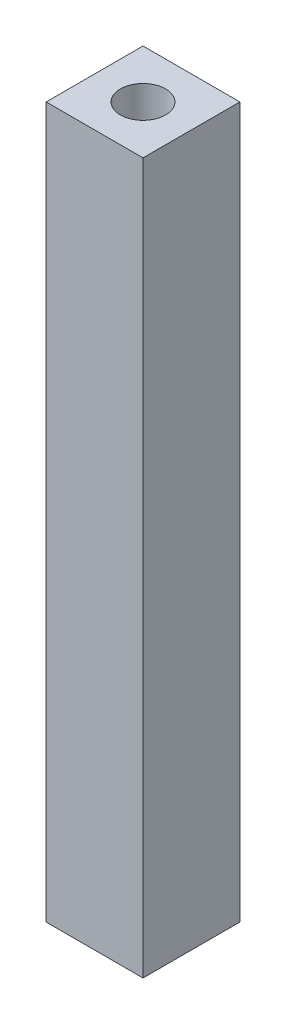
ISO-10303-21;
HEADER;
FILE_DESCRIPTION(('STEP AP214'),'2;1');
FILE_NAME('part.step','',(''),(''),'','','');
FILE_SCHEMA(('AUTOMOTIVE_DESIGN { 1 0 10303 214 1 1 1 1 }'));
ENDSEC;
DATA;
#1=APPLICATION_CONTEXT('core data for automotive mechanical design processes');
#2=APPLICATION_PROTOCOL_DEFINITION('international standard','automotive_design',2000,#1);
#3=PRODUCT_CONTEXT('',#1,'mechanical');
#4=PRODUCT('Part','Part','',(#3));
#5=PRODUCT_RELATED_PRODUCT_CATEGORY('part','',(#4));
#6=PRODUCT_DEFINITION_FORMATION('','',#4);
#7=PRODUCT_DEFINITION_CONTEXT('part definition',#1,'design');
#8=PRODUCT_DEFINITION('design','',#6,#7);
#9=PRODUCT_DEFINITION_SHAPE('','',#8);
#10=(LENGTH_UNIT() NAMED_UNIT(*) SI_UNIT(.MILLI.,.METRE.));
#11=(NAMED_UNIT(*) PLANE_ANGLE_UNIT() SI_UNIT($,.RADIAN.));
#12=(NAMED_UNIT(*) SI_UNIT($,.STERADIAN.) SOLID_ANGLE_UNIT());
#13=UNCERTAINTY_MEASURE_WITH_UNIT(LENGTH_MEASURE(1.E-05),#10,'distance_accuracy_value','');
#14=(GEOMETRIC_REPRESENTATION_CONTEXT(3) GLOBAL_UNCERTAINTY_ASSIGNED_CONTEXT((#13)) GLOBAL_UNIT_ASSIGNED_CONTEXT((#10,
#11,#12)) REPRESENTATION_CONTEXT('',''));
#15=CARTESIAN_POINT('',(0.,0.,0.));
#16=DIRECTION('',(0.,0.,1.));
#17=DIRECTION('',(1.,0.,0.));
#18=AXIS2_PLACEMENT_3D('',#15,#16,#17);
#19=CARTESIAN_POINT('',(-1.5,22.,1.5));
#20=DIRECTION('',(-1.,0.,0.));
#21=DIRECTION('',(0.,0.,1.));
#22=AXIS2_PLACEMENT_3D('',#19,#20,#21);
#23=PLANE('',#22);
#24=DIRECTION('',(0.,0.,-1.));
#25=VECTOR('',#24,1.);
#26=CARTESIAN_POINT('',(-1.5,0.,1.5));
#27=LINE('',#26,#25);
#28=CARTESIAN_POINT('',(-1.5,0.,1.5));
#29=VERTEX_POINT('',#28);
#30=CARTESIAN_POINT('',(-1.5,0.,-1.5));
#31=VERTEX_POINT('',#30);
#32=EDGE_CURVE('E105',#29,#31,#27,.T.);
#33=ORIENTED_EDGE('',*,*,#32,.F.);
#34=DIRECTION('',(0.,-1.,0.));
#35=VECTOR('',#34,1.);
#36=CARTESIAN_POINT('',(-1.5,22.,1.5));
#37=LINE('',#36,#35);
#38=CARTESIAN_POINT('',(-1.5,22.,1.5));
#39=VERTEX_POINT('',#38);
#40=EDGE_CURVE('E11',#39,#29,#37,.T.);
#41=ORIENTED_EDGE('',*,*,#40,.F.);
#42=DIRECTION('',(0.,0.,-1.));
#43=VECTOR('',#42,1.);
#44=CARTESIAN_POINT('',(-1.5,22.,1.5));
#45=LINE('',#44,#43);
#46=CARTESIAN_POINT('',(-1.5,22.,-1.5));
#47=VERTEX_POINT('',#46);
#48=EDGE_CURVE('E99',#39,#47,#45,.T.);
#49=ORIENTED_EDGE('',*,*,#48,.T.);
#50=DIRECTION('',(0.,-1.,0.));
#51=VECTOR('',#50,1.);
#52=CARTESIAN_POINT('',(-1.5,22.,-1.5));
#53=LINE('',#52,#51);
#54=EDGE_CURVE('E42',#47,#31,#53,.T.);
#55=ORIENTED_EDGE('',*,*,#54,.T.);
#56=EDGE_LOOP('',(#33,#41,#49,#55));
#57=FACE_BOUND('',#56,.T.);
#58=ADVANCED_FACE('F39',(#57),#23,.T.);
#59=CARTESIAN_POINT('',(-1.5,22.,1.5));
#60=DIRECTION('',(0.,0.,-1.));
#61=DIRECTION('',(-1.,0.,0.));
#62=AXIS2_PLACEMENT_3D('',#59,#60,#61);
#63=PLANE('',#62);
#64=DIRECTION('',(1.,0.,0.));
#65=VECTOR('',#64,1.);
#66=CARTESIAN_POINT('',(-1.5,0.,1.5));
#67=LINE('',#66,#65);
#68=CARTESIAN_POINT('',(1.5,0.,1.5));
#69=VERTEX_POINT('',#68);
#70=EDGE_CURVE('E72',#29,#69,#67,.T.);
#71=ORIENTED_EDGE('',*,*,#70,.T.);
#72=DIRECTION('',(0.,-1.,0.));
#73=VECTOR('',#72,1.);
#74=CARTESIAN_POINT('',(1.5,22.,1.5));
#75=LINE('',#74,#73);
#76=CARTESIAN_POINT('',(1.5,22.,1.5));
#77=VERTEX_POINT('',#76);
#78=EDGE_CURVE('E48',#77,#69,#75,.T.);
#79=ORIENTED_EDGE('',*,*,#78,.F.);
#80=DIRECTION('',(1.,0.,0.));
#81=VECTOR('',#80,1.);
#82=CARTESIAN_POINT('',(-1.5,22.,1.5));
#83=LINE('',#82,#81);
#84=EDGE_CURVE('E89',#39,#77,#83,.T.);
#85=ORIENTED_EDGE('',*,*,#84,.F.);
#86=ORIENTED_EDGE('',*,*,#40,.T.);
#87=EDGE_LOOP('',(#71,#79,#85,#86));
#88=FACE_BOUND('',#87,.T.);
#89=ADVANCED_FACE('F116',(#88),#63,.F.);
#90=CARTESIAN_POINT('',(1.5,22.,1.5));
#91=DIRECTION('',(-1.,0.,0.));
#92=DIRECTION('',(0.,0.,1.));
#93=AXIS2_PLACEMENT_3D('',#90,#91,#92);
#94=PLANE('',#93);
#95=DIRECTION('',(0.,0.,-1.));
#96=VECTOR('',#95,1.);
#97=CARTESIAN_POINT('',(1.5,0.,1.5));
#98=LINE('',#97,#96);
#99=CARTESIAN_POINT('',(1.5,0.,-1.5));
#100=VERTEX_POINT('',#99);
#101=EDGE_CURVE('E96',#69,#100,#98,.T.);
#102=ORIENTED_EDGE('',*,*,#101,.T.);
#103=DIRECTION('',(0.,-1.,0.));
#104=VECTOR('',#103,1.);
#105=CARTESIAN_POINT('',(1.5,22.,-1.5));
#106=LINE('',#105,#104);
#107=CARTESIAN_POINT('',(1.5,22.,-1.5));
#108=VERTEX_POINT('',#107);
#109=EDGE_CURVE('E93',#108,#100,#106,.T.);
#110=ORIENTED_EDGE('',*,*,#109,.F.);
#111=DIRECTION('',(0.,0.,-1.));
#112=VECTOR('',#111,1.);
#113=CARTESIAN_POINT('',(1.5,22.,1.5));
#114=LINE('',#113,#112);
#115=EDGE_CURVE('E84',#77,#108,#114,.T.);
#116=ORIENTED_EDGE('',*,*,#115,.F.);
#117=ORIENTED_EDGE('',*,*,#78,.T.);
#118=EDGE_LOOP('',(#102,#110,#116,#117));
#119=FACE_BOUND('',#118,.T.);
#120=ADVANCED_FACE('F94',(#119),#94,.F.);
#121=CARTESIAN_POINT('',(-1.5,22.,-1.5));
#122=DIRECTION('',(0.,0.,-1.));
#123=DIRECTION('',(-1.,0.,0.));
#124=AXIS2_PLACEMENT_3D('',#121,#122,#123);
#125=PLANE('',#124);
#126=DIRECTION('',(1.,0.,0.));
#127=VECTOR('',#126,1.);
#128=CARTESIAN_POINT('',(-1.5,0.,-1.5));
#129=LINE('',#128,#127);
#130=EDGE_CURVE('E108',#31,#100,#129,.T.);
#131=ORIENTED_EDGE('',*,*,#130,.F.);
#132=ORIENTED_EDGE('',*,*,#54,.F.);
#133=DIRECTION('',(1.,0.,0.));
#134=VECTOR('',#133,1.);
#135=CARTESIAN_POINT('',(-1.5,22.,-1.5));
#136=LINE('',#135,#134);
#137=EDGE_CURVE('E88',#47,#108,#136,.T.);
#138=ORIENTED_EDGE('',*,*,#137,.T.);
#139=ORIENTED_EDGE('',*,*,#109,.T.);
#140=EDGE_LOOP('',(#131,#132,#138,#139));
#141=FACE_BOUND('',#140,.T.);
#142=ADVANCED_FACE('F98',(#141),#125,.T.);
#143=CARTESIAN_POINT('',(0.,22.,0.));
#144=DIRECTION('',(0.,-1.,0.));
#145=DIRECTION('',(0.,0.,-1.));
#146=AXIS2_PLACEMENT_3D('',#143,#144,#145);
#147=PLANE('',#146);
#148=CARTESIAN_POINT('',(0.,22.,0.));
#149=DIRECTION('',(0.,-1.,0.));
#150=DIRECTION('',(0.,0.,-1.));
#151=AXIS2_PLACEMENT_3D('',#148,#149,#150);
#152=CIRCLE('',#151,0.7);
#153=CARTESIAN_POINT('',(0.,22.,-0.7));
#154=VERTEX_POINT('',#153);
#155=EDGE_CURVE('E159',#154,#154,#152,.T.);
#156=ORIENTED_EDGE('',*,*,#155,.T.);
#157=EDGE_LOOP('',(#156));
#158=FACE_BOUND('',#157,.T.);
#159=ORIENTED_EDGE('',*,*,#48,.F.);
#160=ORIENTED_EDGE('',*,*,#84,.T.);
#161=ORIENTED_EDGE('',*,*,#115,.T.);
#162=ORIENTED_EDGE('',*,*,#137,.F.);
#163=EDGE_LOOP('',(#159,#160,#161,#162));
#164=FACE_BOUND('',#163,.T.);
#165=ADVANCED_FACE('F87',(#158,#164),#147,.F.);
#166=CARTESIAN_POINT('',(0.,0.,0.));
#167=DIRECTION('',(0.,-1.,0.));
#168=DIRECTION('',(0.,0.,-1.));
#169=AXIS2_PLACEMENT_3D('',#166,#167,#168);
#170=PLANE('',#169);
#171=CARTESIAN_POINT('',(0.,0.,0.));
#172=DIRECTION('',(0.,1.,0.));
#173=DIRECTION('',(0.,0.,1.));
#174=AXIS2_PLACEMENT_3D('',#171,#172,#173);
#175=CIRCLE('',#174,0.7);
#176=CARTESIAN_POINT('',(0.,0.,0.7));
#177=VERTEX_POINT('',#176);
#178=EDGE_CURVE('E158',#177,#177,#175,.T.);
#179=ORIENTED_EDGE('',*,*,#178,.T.);
#180=EDGE_LOOP('',(#179));
#181=FACE_BOUND('',#180,.T.);
#182=ORIENTED_EDGE('',*,*,#32,.T.);
#183=ORIENTED_EDGE('',*,*,#130,.T.);
#184=ORIENTED_EDGE('',*,*,#101,.F.);
#185=ORIENTED_EDGE('',*,*,#70,.F.);
#186=EDGE_LOOP('',(#182,#183,#184,#185));
#187=FACE_BOUND('',#186,.T.);
#188=ADVANCED_FACE('F114',(#181,#187),#170,.T.);
#189=CARTESIAN_POINT('',(0.,3.,0.));
#190=DIRECTION('',(0.,-1.,0.));
#191=DIRECTION('',(0.,0.,-1.));
#192=AXIS2_PLACEMENT_3D('',#189,#190,#191);
#193=CYLINDRICAL_SURFACE('',#192,0.7);
#194=CARTESIAN_POINT('',(0.,3.,0.));
#195=DIRECTION('',(0.,1.,0.));
#196=DIRECTION('',(0.,0.,1.));
#197=AXIS2_PLACEMENT_3D('',#194,#195,#196);
#198=CIRCLE('',#197,0.7);
#199=CARTESIAN_POINT('',(0.,3.,0.7));
#200=VERTEX_POINT('',#199);
#201=EDGE_CURVE('E109',#200,#200,#198,.T.);
#202=ORIENTED_EDGE('',*,*,#201,.T.);
#203=EDGE_LOOP('',(#202));
#204=FACE_BOUND('',#203,.T.);
#205=ORIENTED_EDGE('',*,*,#178,.F.);
#206=EDGE_LOOP('',(#205));
#207=FACE_BOUND('',#206,.T.);
#208=ADVANCED_FACE('F135',(#204,#207),#193,.F.);
#209=CARTESIAN_POINT('',(0.,3.,0.));
#210=DIRECTION('',(0.,1.,0.));
#211=DIRECTION('',(0.,0.,1.));
#212=AXIS2_PLACEMENT_3D('',#209,#210,#211);
#213=PLANE('',#212);
#214=ORIENTED_EDGE('',*,*,#201,.F.);
#215=EDGE_LOOP('',(#214));
#216=FACE_BOUND('',#215,.T.);
#217=ADVANCED_FACE('F141',(#216),#213,.F.);
#218=CARTESIAN_POINT('',(0.,19.,0.));
#219=DIRECTION('',(0.,1.,0.));
#220=DIRECTION('',(0.,0.,1.));
#221=AXIS2_PLACEMENT_3D('',#218,#219,#220);
#222=CYLINDRICAL_SURFACE('',#221,0.7);
#223=CARTESIAN_POINT('',(0.,19.,0.));
#224=DIRECTION('',(0.,-1.,0.));
#225=DIRECTION('',(0.,0.,-1.));
#226=AXIS2_PLACEMENT_3D('',#223,#224,#225);
#227=CIRCLE('',#226,0.7);
#228=CARTESIAN_POINT('',(0.,19.,-0.7));
#229=VERTEX_POINT('',#228);
#230=EDGE_CURVE('E157',#229,#229,#227,.T.);
#231=ORIENTED_EDGE('',*,*,#230,.T.);
#232=EDGE_LOOP('',(#231));
#233=FACE_BOUND('',#232,.T.);
#234=ORIENTED_EDGE('',*,*,#155,.F.);
#235=EDGE_LOOP('',(#234));
#236=FACE_BOUND('',#235,.T.);
#237=ADVANCED_FACE('F145',(#233,#236),#222,.F.);
#238=CARTESIAN_POINT('',(0.,19.,0.));
#239=DIRECTION('',(0.,-1.,0.));
#240=DIRECTION('',(0.,0.,-1.));
#241=AXIS2_PLACEMENT_3D('',#238,#239,#240);
#242=PLANE('',#241);
#243=ORIENTED_EDGE('',*,*,#230,.F.);
#244=EDGE_LOOP('',(#243));
#245=FACE_BOUND('',#244,.T.);
#246=ADVANCED_FACE('F149',(#245),#242,.F.);
#247=CLOSED_SHELL('',(#58,#89,#120,#142,#165,#188,#208,#217,#237,#246));
#248=MANIFOLD_SOLID_BREP('B2',#247);
#249=ADVANCED_BREP_SHAPE_REPRESENTATION('',(#18,#248),#14);
#250=SHAPE_DEFINITION_REPRESENTATION(#9,#249);
ENDSEC;
END-ISO-10303-21;
